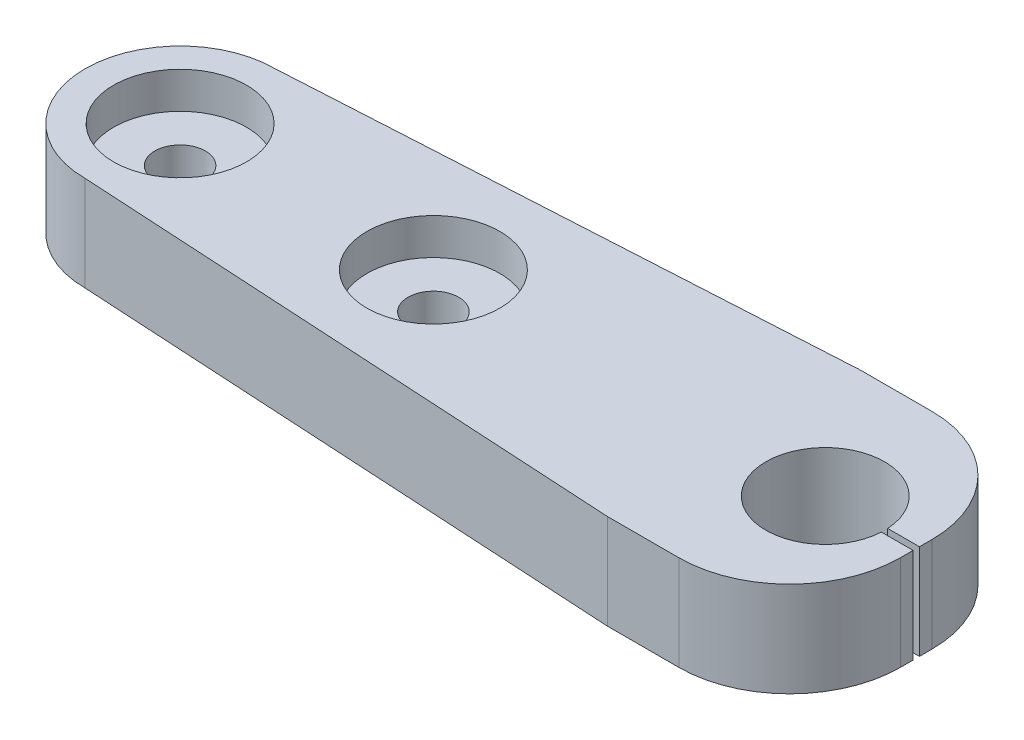
ISO-10303-21;
HEADER;
FILE_DESCRIPTION(('STEP AP214'),'2;1');
FILE_NAME('part.step','',(''),(''),'','','');
FILE_SCHEMA(('AUTOMOTIVE_DESIGN { 1 0 10303 214 1 1 1 1 }'));
ENDSEC;
DATA;
#1=APPLICATION_CONTEXT('core data for automotive mechanical design processes');
#2=APPLICATION_PROTOCOL_DEFINITION('international standard','automotive_design',2000,#1);
#3=PRODUCT_CONTEXT('',#1,'mechanical');
#4=PRODUCT('Part','Part','',(#3));
#5=PRODUCT_RELATED_PRODUCT_CATEGORY('part','',(#4));
#6=PRODUCT_DEFINITION_FORMATION('','',#4);
#7=PRODUCT_DEFINITION_CONTEXT('part definition',#1,'design');
#8=PRODUCT_DEFINITION('design','',#6,#7);
#9=PRODUCT_DEFINITION_SHAPE('','',#8);
#10=(LENGTH_UNIT() NAMED_UNIT(*) SI_UNIT(.MILLI.,.METRE.));
#11=(NAMED_UNIT(*) PLANE_ANGLE_UNIT() SI_UNIT($,.RADIAN.));
#12=(NAMED_UNIT(*) SI_UNIT($,.STERADIAN.) SOLID_ANGLE_UNIT());
#13=UNCERTAINTY_MEASURE_WITH_UNIT(LENGTH_MEASURE(1.E-05),#10,'distance_accuracy_value','');
#14=(GEOMETRIC_REPRESENTATION_CONTEXT(3) GLOBAL_UNCERTAINTY_ASSIGNED_CONTEXT((#13)) GLOBAL_UNIT_ASSIGNED_CONTEXT((#10,
#11,#12)) REPRESENTATION_CONTEXT('',''));
#15=CARTESIAN_POINT('',(0.,0.,0.));
#16=DIRECTION('',(0.,0.,1.));
#17=DIRECTION('',(1.,0.,0.));
#18=AXIS2_PLACEMENT_3D('',#15,#16,#17);
#19=CARTESIAN_POINT('',(5.75,6.,-10.));
#20=DIRECTION('',(0.,1.,0.));
#21=DIRECTION('',(0.,0.,1.));
#22=AXIS2_PLACEMENT_3D('',#19,#20,#21);
#23=PLANE('',#22);
#24=CARTESIAN_POINT('',(-19.,6.,-10.));
#25=DIRECTION('',(0.,1.,0.));
#26=DIRECTION('',(0.,0.,1.));
#27=AXIS2_PLACEMENT_3D('',#24,#25,#26);
#28=CIRCLE('',#27,4.2);
#29=CARTESIAN_POINT('',(-19.,6.,-5.80000000000001));
#30=VERTEX_POINT('',#29);
#31=EDGE_CURVE('E292',#30,#30,#28,.T.);
#32=ORIENTED_EDGE('',*,*,#31,.F.);
#33=EDGE_LOOP('',(#32));
#34=FACE_BOUND('',#33,.T.);
#35=CARTESIAN_POINT('',(-35.,6.,-10.));
#36=DIRECTION('',(0.,1.,0.));
#37=DIRECTION('',(0.,0.,1.));
#38=AXIS2_PLACEMENT_3D('',#35,#36,#37);
#39=CIRCLE('',#38,4.2);
#40=CARTESIAN_POINT('',(-35.,6.,-5.80000000000001));
#41=VERTEX_POINT('',#40);
#42=EDGE_CURVE('E302',#41,#41,#39,.T.);
#43=ORIENTED_EDGE('',*,*,#42,.F.);
#44=EDGE_LOOP('',(#43));
#45=FACE_BOUND('',#44,.T.);
#46=DIRECTION('',(-1.,0.,0.));
#47=VECTOR('',#46,1.);
#48=CARTESIAN_POINT('',(11.5,6.,-9.8));
#49=LINE('',#48,#47);
#50=CARTESIAN_POINT('',(11.5,6.,-9.8));
#51=VERTEX_POINT('',#50);
#52=CARTESIAN_POINT('',(9.49466286867056,6.,-9.8));
#53=VERTEX_POINT('',#52);
#54=EDGE_CURVE('E177',#51,#53,#49,.T.);
#55=ORIENTED_EDGE('',*,*,#54,.T.);
#56=CARTESIAN_POINT('',(5.75,6.,-10.));
#57=DIRECTION('',(0.,-1.,0.));
#58=DIRECTION('',(0.,0.,1.));
#59=AXIS2_PLACEMENT_3D('',#56,#57,#58);
#60=CIRCLE('',#59,3.75);
#61=CARTESIAN_POINT('',(9.49466286867056,6.,-10.2));
#62=VERTEX_POINT('',#61);
#63=EDGE_CURVE('E106',#53,#62,#60,.T.);
#64=ORIENTED_EDGE('',*,*,#63,.T.);
#65=DIRECTION('',(1.,0.,0.));
#66=VECTOR('',#65,1.);
#67=CARTESIAN_POINT('',(11.5,6.,-10.2));
#68=LINE('',#67,#66);
#69=CARTESIAN_POINT('',(11.5,6.,-10.2));
#70=VERTEX_POINT('',#69);
#71=EDGE_CURVE('E204',#62,#70,#68,.T.);
#72=ORIENTED_EDGE('',*,*,#71,.T.);
#73=DIRECTION('',(0.,0.,-1.));
#74=VECTOR('',#73,1.);
#75=CARTESIAN_POINT('',(11.5,6.,-10.2));
#76=LINE('',#75,#74);
#77=CARTESIAN_POINT('',(11.5,6.,-11.));
#78=VERTEX_POINT('',#77);
#79=EDGE_CURVE('E222',#70,#78,#76,.T.);
#80=ORIENTED_EDGE('',*,*,#79,.T.);
#81=CARTESIAN_POINT('',(4.5,6.,-11.));
#82=DIRECTION('',(0.,1.,0.));
#83=DIRECTION('',(0.,0.,1.));
#84=AXIS2_PLACEMENT_3D('',#81,#82,#83);
#85=CIRCLE('',#84,7.);
#86=CARTESIAN_POINT('',(4.49999999999995,6.,-18.));
#87=VERTEX_POINT('',#86);
#88=EDGE_CURVE('E219',#78,#87,#85,.T.);
#89=ORIENTED_EDGE('',*,*,#88,.T.);
#90=DIRECTION('',(-1.,0.,0.));
#91=VECTOR('',#90,1.);
#92=CARTESIAN_POINT('',(0.,6.,-18.));
#93=LINE('',#92,#91);
#94=CARTESIAN_POINT('',(0.,6.,-18.));
#95=VERTEX_POINT('',#94);
#96=EDGE_CURVE('E221',#87,#95,#93,.T.);
#97=ORIENTED_EDGE('',*,*,#96,.T.);
#98=DIRECTION('',(-0.998371334423977,0.,0.057049790538513));
#99=VECTOR('',#98,1.);
#100=CARTESIAN_POINT('',(0.,6.,-18.));
#101=LINE('',#100,#99);
#102=CARTESIAN_POINT('',(-35.,6.,-16.));
#103=VERTEX_POINT('',#102);
#104=EDGE_CURVE('E224',#95,#103,#101,.T.);
#105=ORIENTED_EDGE('',*,*,#104,.T.);
#106=CARTESIAN_POINT('',(-35.,6.,-10.));
#107=DIRECTION('',(0.,1.,0.));
#108=DIRECTION('',(0.,0.,1.));
#109=AXIS2_PLACEMENT_3D('',#106,#107,#108);
#110=CIRCLE('',#109,6.);
#111=CARTESIAN_POINT('',(-35.,6.,-4.));
#112=VERTEX_POINT('',#111);
#113=EDGE_CURVE('E230',#103,#112,#110,.T.);
#114=ORIENTED_EDGE('',*,*,#113,.T.);
#115=DIRECTION('',(0.998371334423977,0.,0.057049790538513));
#116=VECTOR('',#115,1.);
#117=CARTESIAN_POINT('',(0.,6.,-2.));
#118=LINE('',#117,#116);
#119=CARTESIAN_POINT('',(0.,6.,-2.));
#120=VERTEX_POINT('',#119);
#121=EDGE_CURVE('E136',#112,#120,#118,.T.);
#122=ORIENTED_EDGE('',*,*,#121,.T.);
#123=DIRECTION('',(1.,0.,0.));
#124=VECTOR('',#123,1.);
#125=CARTESIAN_POINT('',(0.,6.,-2.));
#126=LINE('',#125,#124);
#127=CARTESIAN_POINT('',(4.49999999999995,6.,-2.));
#128=VERTEX_POINT('',#127);
#129=EDGE_CURVE('E131',#120,#128,#126,.T.);
#130=ORIENTED_EDGE('',*,*,#129,.T.);
#131=CARTESIAN_POINT('',(4.5,6.,-9.));
#132=DIRECTION('',(0.,1.,0.));
#133=DIRECTION('',(0.,0.,1.));
#134=AXIS2_PLACEMENT_3D('',#131,#132,#133);
#135=CIRCLE('',#134,7.);
#136=CARTESIAN_POINT('',(11.5,6.,-9.00000000000005));
#137=VERTEX_POINT('',#136);
#138=EDGE_CURVE('E134',#128,#137,#135,.T.);
#139=ORIENTED_EDGE('',*,*,#138,.T.);
#140=DIRECTION('',(0.,0.,-1.));
#141=VECTOR('',#140,1.);
#142=CARTESIAN_POINT('',(11.5,6.,-9.8));
#143=LINE('',#142,#141);
#144=EDGE_CURVE('E51',#137,#51,#143,.T.);
#145=ORIENTED_EDGE('',*,*,#144,.T.);
#146=EDGE_LOOP('',(#55,#64,#72,#80,#89,#97,#105,#114,#122,#130,#139,#145));
#147=FACE_BOUND('',#146,.T.);
#148=ADVANCED_FACE('F34',(#34,#45,#147),#23,.T.);
#149=CARTESIAN_POINT('',(5.75,0.,-10.));
#150=DIRECTION('',(0.,1.,0.));
#151=DIRECTION('',(0.,0.,1.));
#152=AXIS2_PLACEMENT_3D('',#149,#150,#151);
#153=PLANE('',#152);
#154=CARTESIAN_POINT('',(-19.,0.,-10.));
#155=DIRECTION('',(0.,1.,0.));
#156=DIRECTION('',(0.,0.,1.));
#157=AXIS2_PLACEMENT_3D('',#154,#155,#156);
#158=CIRCLE('',#157,1.60000000000001);
#159=CARTESIAN_POINT('',(-19.,0.,-8.39999999999999));
#160=VERTEX_POINT('',#159);
#161=EDGE_CURVE('E299',#160,#160,#158,.T.);
#162=ORIENTED_EDGE('',*,*,#161,.T.);
#163=EDGE_LOOP('',(#162));
#164=FACE_BOUND('',#163,.T.);
#165=CARTESIAN_POINT('',(-35.,0.,-10.));
#166=DIRECTION('',(0.,1.,0.));
#167=DIRECTION('',(0.,0.,1.));
#168=AXIS2_PLACEMENT_3D('',#165,#166,#167);
#169=CIRCLE('',#168,1.60000000000001);
#170=CARTESIAN_POINT('',(-35.,0.,-8.39999999999999));
#171=VERTEX_POINT('',#170);
#172=EDGE_CURVE('E158',#171,#171,#169,.T.);
#173=ORIENTED_EDGE('',*,*,#172,.T.);
#174=EDGE_LOOP('',(#173));
#175=FACE_BOUND('',#174,.T.);
#176=DIRECTION('',(-1.,0.,0.));
#177=VECTOR('',#176,1.);
#178=CARTESIAN_POINT('',(11.5,0.,-9.8));
#179=LINE('',#178,#177);
#180=CARTESIAN_POINT('',(11.5,0.,-9.8));
#181=VERTEX_POINT('',#180);
#182=CARTESIAN_POINT('',(9.49466286867056,0.,-9.8));
#183=VERTEX_POINT('',#182);
#184=EDGE_CURVE('E154',#181,#183,#179,.T.);
#185=ORIENTED_EDGE('',*,*,#184,.F.);
#186=DIRECTION('',(0.,0.,-1.));
#187=VECTOR('',#186,1.);
#188=CARTESIAN_POINT('',(11.5,0.,-9.8));
#189=LINE('',#188,#187);
#190=CARTESIAN_POINT('',(11.5,0.,-9.00000000000005));
#191=VERTEX_POINT('',#190);
#192=EDGE_CURVE('E98',#191,#181,#189,.T.);
#193=ORIENTED_EDGE('',*,*,#192,.F.);
#194=CARTESIAN_POINT('',(4.5,0.,-9.));
#195=DIRECTION('',(0.,1.,0.));
#196=DIRECTION('',(0.,0.,1.));
#197=AXIS2_PLACEMENT_3D('',#194,#195,#196);
#198=CIRCLE('',#197,7.);
#199=CARTESIAN_POINT('',(4.49999999999995,0.,-2.));
#200=VERTEX_POINT('',#199);
#201=EDGE_CURVE('E92',#200,#191,#198,.T.);
#202=ORIENTED_EDGE('',*,*,#201,.F.);
#203=DIRECTION('',(1.,0.,0.));
#204=VECTOR('',#203,1.);
#205=CARTESIAN_POINT('',(0.,0.,-2.));
#206=LINE('',#205,#204);
#207=CARTESIAN_POINT('',(0.,0.,-2.));
#208=VERTEX_POINT('',#207);
#209=EDGE_CURVE('E144',#208,#200,#206,.T.);
#210=ORIENTED_EDGE('',*,*,#209,.F.);
#211=DIRECTION('',(0.998371334423977,0.,0.057049790538513));
#212=VECTOR('',#211,1.);
#213=CARTESIAN_POINT('',(0.,0.,-2.));
#214=LINE('',#213,#212);
#215=CARTESIAN_POINT('',(-35.,0.,-4.));
#216=VERTEX_POINT('',#215);
#217=EDGE_CURVE('E172',#216,#208,#214,.T.);
#218=ORIENTED_EDGE('',*,*,#217,.F.);
#219=CARTESIAN_POINT('',(-35.,0.,-10.));
#220=DIRECTION('',(0.,1.,0.));
#221=DIRECTION('',(0.,0.,1.));
#222=AXIS2_PLACEMENT_3D('',#219,#220,#221);
#223=CIRCLE('',#222,6.);
#224=CARTESIAN_POINT('',(-35.,0.,-16.));
#225=VERTEX_POINT('',#224);
#226=EDGE_CURVE('E170',#225,#216,#223,.T.);
#227=ORIENTED_EDGE('',*,*,#226,.F.);
#228=DIRECTION('',(-0.998371334423977,0.,0.057049790538513));
#229=VECTOR('',#228,1.);
#230=CARTESIAN_POINT('',(0.,0.,-18.));
#231=LINE('',#230,#229);
#232=CARTESIAN_POINT('',(0.,0.,-18.));
#233=VERTEX_POINT('',#232);
#234=EDGE_CURVE('E168',#233,#225,#231,.T.);
#235=ORIENTED_EDGE('',*,*,#234,.F.);
#236=DIRECTION('',(-1.,0.,0.));
#237=VECTOR('',#236,1.);
#238=CARTESIAN_POINT('',(0.,0.,-18.));
#239=LINE('',#238,#237);
#240=CARTESIAN_POINT('',(4.49999999999995,0.,-18.));
#241=VERTEX_POINT('',#240);
#242=EDGE_CURVE('E166',#241,#233,#239,.T.);
#243=ORIENTED_EDGE('',*,*,#242,.F.);
#244=CARTESIAN_POINT('',(4.5,0.,-11.));
#245=DIRECTION('',(0.,1.,0.));
#246=DIRECTION('',(0.,0.,1.));
#247=AXIS2_PLACEMENT_3D('',#244,#245,#246);
#248=CIRCLE('',#247,7.);
#249=CARTESIAN_POINT('',(11.5,0.,-11.));
#250=VERTEX_POINT('',#249);
#251=EDGE_CURVE('E164',#250,#241,#248,.T.);
#252=ORIENTED_EDGE('',*,*,#251,.F.);
#253=DIRECTION('',(0.,0.,-1.));
#254=VECTOR('',#253,1.);
#255=CARTESIAN_POINT('',(11.5,0.,-10.2));
#256=LINE('',#255,#254);
#257=CARTESIAN_POINT('',(11.5,0.,-10.2));
#258=VERTEX_POINT('',#257);
#259=EDGE_CURVE('E162',#258,#250,#256,.T.);
#260=ORIENTED_EDGE('',*,*,#259,.F.);
#261=DIRECTION('',(1.,0.,0.));
#262=VECTOR('',#261,1.);
#263=CARTESIAN_POINT('',(11.5,0.,-10.2));
#264=LINE('',#263,#262);
#265=CARTESIAN_POINT('',(9.49466286867056,0.,-10.2));
#266=VERTEX_POINT('',#265);
#267=EDGE_CURVE('E160',#266,#258,#264,.T.);
#268=ORIENTED_EDGE('',*,*,#267,.F.);
#269=CARTESIAN_POINT('',(5.75,0.,-10.));
#270=DIRECTION('',(0.,-1.,0.));
#271=DIRECTION('',(0.,0.,1.));
#272=AXIS2_PLACEMENT_3D('',#269,#270,#271);
#273=CIRCLE('',#272,3.75);
#274=EDGE_CURVE('E157',#183,#266,#273,.T.);
#275=ORIENTED_EDGE('',*,*,#274,.F.);
#276=EDGE_LOOP('',(#185,#193,#202,#210,#218,#227,#235,#243,#252,#260,#268,#275));
#277=FACE_BOUND('',#276,.T.);
#278=ADVANCED_FACE('F208',(#164,#175,#277),#153,.F.);
#279=CARTESIAN_POINT('',(11.5,6.,-9.8));
#280=DIRECTION('',(0.,0.,1.));
#281=DIRECTION('',(1.,0.,0.));
#282=AXIS2_PLACEMENT_3D('',#279,#280,#281);
#283=PLANE('',#282);
#284=ORIENTED_EDGE('',*,*,#184,.T.);
#285=DIRECTION('',(0.,-1.,0.));
#286=VECTOR('',#285,1.);
#287=CARTESIAN_POINT('',(9.49466286867056,6.,-9.8));
#288=LINE('',#287,#286);
#289=EDGE_CURVE('E11',#53,#183,#288,.T.);
#290=ORIENTED_EDGE('',*,*,#289,.F.);
#291=ORIENTED_EDGE('',*,*,#54,.F.);
#292=DIRECTION('',(0.,-1.,0.));
#293=VECTOR('',#292,1.);
#294=CARTESIAN_POINT('',(11.5,6.,-9.8));
#295=LINE('',#294,#293);
#296=EDGE_CURVE('E150',#51,#181,#295,.T.);
#297=ORIENTED_EDGE('',*,*,#296,.T.);
#298=EDGE_LOOP('',(#284,#290,#291,#297));
#299=FACE_BOUND('',#298,.T.);
#300=ADVANCED_FACE('F36',(#299),#283,.F.);
#301=CARTESIAN_POINT('',(5.75,6.,-10.));
#302=DIRECTION('',(0.,-1.,0.));
#303=DIRECTION('',(0.,0.,-1.));
#304=AXIS2_PLACEMENT_3D('',#301,#302,#303);
#305=CYLINDRICAL_SURFACE('',#304,3.75);
#306=ORIENTED_EDGE('',*,*,#274,.T.);
#307=DIRECTION('',(0.,-1.,0.));
#308=VECTOR('',#307,1.);
#309=CARTESIAN_POINT('',(9.49466286867056,6.,-10.2));
#310=LINE('',#309,#308);
#311=EDGE_CURVE('E43',#62,#266,#310,.T.);
#312=ORIENTED_EDGE('',*,*,#311,.F.);
#313=ORIENTED_EDGE('',*,*,#63,.F.);
#314=ORIENTED_EDGE('',*,*,#289,.T.);
#315=EDGE_LOOP('',(#306,#312,#313,#314));
#316=FACE_BOUND('',#315,.T.);
#317=ADVANCED_FACE('F437',(#316),#305,.F.);
#318=CARTESIAN_POINT('',(11.5,6.,-10.2));
#319=DIRECTION('',(0.,0.,-1.));
#320=DIRECTION('',(-1.,0.,0.));
#321=AXIS2_PLACEMENT_3D('',#318,#319,#320);
#322=PLANE('',#321);
#323=ORIENTED_EDGE('',*,*,#267,.T.);
#324=DIRECTION('',(0.,-1.,0.));
#325=VECTOR('',#324,1.);
#326=CARTESIAN_POINT('',(11.5,6.,-10.2));
#327=LINE('',#326,#325);
#328=EDGE_CURVE('E196',#70,#258,#327,.T.);
#329=ORIENTED_EDGE('',*,*,#328,.F.);
#330=ORIENTED_EDGE('',*,*,#71,.F.);
#331=ORIENTED_EDGE('',*,*,#311,.T.);
#332=EDGE_LOOP('',(#323,#329,#330,#331));
#333=FACE_BOUND('',#332,.T.);
#334=ADVANCED_FACE('F202',(#333),#322,.F.);
#335=CARTESIAN_POINT('',(11.5,6.,-10.2));
#336=DIRECTION('',(-1.,0.,0.));
#337=DIRECTION('',(0.,0.,1.));
#338=AXIS2_PLACEMENT_3D('',#335,#336,#337);
#339=PLANE('',#338);
#340=ORIENTED_EDGE('',*,*,#259,.T.);
#341=DIRECTION('',(0.,-1.,0.));
#342=VECTOR('',#341,1.);
#343=CARTESIAN_POINT('',(11.5,6.,-11.));
#344=LINE('',#343,#342);
#345=EDGE_CURVE('E193',#78,#250,#344,.T.);
#346=ORIENTED_EDGE('',*,*,#345,.F.);
#347=ORIENTED_EDGE('',*,*,#79,.F.);
#348=ORIENTED_EDGE('',*,*,#328,.T.);
#349=EDGE_LOOP('',(#340,#346,#347,#348));
#350=FACE_BOUND('',#349,.T.);
#351=ADVANCED_FACE('F213',(#350),#339,.F.);
#352=CARTESIAN_POINT('',(4.5,6.,-11.));
#353=DIRECTION('',(0.,-1.,0.));
#354=DIRECTION('',(0.,0.,-1.));
#355=AXIS2_PLACEMENT_3D('',#352,#353,#354);
#356=CYLINDRICAL_SURFACE('',#355,7.);
#357=ORIENTED_EDGE('',*,*,#251,.T.);
#358=DIRECTION('',(0.,-1.,0.));
#359=VECTOR('',#358,1.);
#360=CARTESIAN_POINT('',(4.49999999999995,6.,-18.));
#361=LINE('',#360,#359);
#362=EDGE_CURVE('E190',#87,#241,#361,.T.);
#363=ORIENTED_EDGE('',*,*,#362,.F.);
#364=ORIENTED_EDGE('',*,*,#88,.F.);
#365=ORIENTED_EDGE('',*,*,#345,.T.);
#366=EDGE_LOOP('',(#357,#363,#364,#365));
#367=FACE_BOUND('',#366,.T.);
#368=ADVANCED_FACE('F217',(#367),#356,.T.);
#369=CARTESIAN_POINT('',(0.,6.,-18.));
#370=DIRECTION('',(0.,0.,1.));
#371=DIRECTION('',(1.,0.,0.));
#372=AXIS2_PLACEMENT_3D('',#369,#370,#371);
#373=PLANE('',#372);
#374=ORIENTED_EDGE('',*,*,#242,.T.);
#375=DIRECTION('',(0.,-1.,0.));
#376=VECTOR('',#375,1.);
#377=CARTESIAN_POINT('',(0.,6.,-18.));
#378=LINE('',#377,#376);
#379=EDGE_CURVE('E187',#95,#233,#378,.T.);
#380=ORIENTED_EDGE('',*,*,#379,.F.);
#381=ORIENTED_EDGE('',*,*,#96,.F.);
#382=ORIENTED_EDGE('',*,*,#362,.T.);
#383=EDGE_LOOP('',(#374,#380,#381,#382));
#384=FACE_BOUND('',#383,.T.);
#385=ADVANCED_FACE('F402',(#384),#373,.F.);
#386=CARTESIAN_POINT('',(0.,6.,-18.));
#387=DIRECTION('',(0.057049790538513,0.,0.998371334423977));
#388=DIRECTION('',(0.998371334423977,0.,-0.057049790538513));
#389=AXIS2_PLACEMENT_3D('',#386,#387,#388);
#390=PLANE('',#389);
#391=ORIENTED_EDGE('',*,*,#234,.T.);
#392=DIRECTION('',(0.,-1.,0.));
#393=VECTOR('',#392,1.);
#394=CARTESIAN_POINT('',(-35.,6.,-16.));
#395=LINE('',#394,#393);
#396=EDGE_CURVE('E184',#103,#225,#395,.T.);
#397=ORIENTED_EDGE('',*,*,#396,.F.);
#398=ORIENTED_EDGE('',*,*,#104,.F.);
#399=ORIENTED_EDGE('',*,*,#379,.T.);
#400=EDGE_LOOP('',(#391,#397,#398,#399));
#401=FACE_BOUND('',#400,.T.);
#402=ADVANCED_FACE('F393',(#401),#390,.F.);
#403=CARTESIAN_POINT('',(-35.,6.,-10.));
#404=DIRECTION('',(0.,-1.,0.));
#405=DIRECTION('',(0.,0.,-1.));
#406=AXIS2_PLACEMENT_3D('',#403,#404,#405);
#407=CYLINDRICAL_SURFACE('',#406,6.);
#408=ORIENTED_EDGE('',*,*,#226,.T.);
#409=DIRECTION('',(0.,-1.,0.));
#410=VECTOR('',#409,1.);
#411=CARTESIAN_POINT('',(-35.,6.,-4.));
#412=LINE('',#411,#410);
#413=EDGE_CURVE('E181',#112,#216,#412,.T.);
#414=ORIENTED_EDGE('',*,*,#413,.F.);
#415=ORIENTED_EDGE('',*,*,#113,.F.);
#416=ORIENTED_EDGE('',*,*,#396,.T.);
#417=EDGE_LOOP('',(#408,#414,#415,#416));
#418=FACE_BOUND('',#417,.T.);
#419=ADVANCED_FACE('F236',(#418),#407,.T.);
#420=CARTESIAN_POINT('',(0.,6.,-2.));
#421=DIRECTION('',(0.057049790538513,0.,-0.998371334423977));
#422=DIRECTION('',(-0.998371334423977,0.,-0.057049790538513));
#423=AXIS2_PLACEMENT_3D('',#420,#421,#422);
#424=PLANE('',#423);
#425=ORIENTED_EDGE('',*,*,#217,.T.);
#426=DIRECTION('',(0.,-1.,0.));
#427=VECTOR('',#426,1.);
#428=CARTESIAN_POINT('',(0.,6.,-2.));
#429=LINE('',#428,#427);
#430=EDGE_CURVE('E145',#120,#208,#429,.T.);
#431=ORIENTED_EDGE('',*,*,#430,.F.);
#432=ORIENTED_EDGE('',*,*,#121,.F.);
#433=ORIENTED_EDGE('',*,*,#413,.T.);
#434=EDGE_LOOP('',(#425,#431,#432,#433));
#435=FACE_BOUND('',#434,.T.);
#436=ADVANCED_FACE('F240',(#435),#424,.F.);
#437=CARTESIAN_POINT('',(0.,6.,-2.));
#438=DIRECTION('',(0.,0.,-1.));
#439=DIRECTION('',(-1.,0.,0.));
#440=AXIS2_PLACEMENT_3D('',#437,#438,#439);
#441=PLANE('',#440);
#442=ORIENTED_EDGE('',*,*,#209,.T.);
#443=DIRECTION('',(0.,-1.,0.));
#444=VECTOR('',#443,1.);
#445=CARTESIAN_POINT('',(4.49999999999995,6.,-2.));
#446=LINE('',#445,#444);
#447=EDGE_CURVE('E141',#128,#200,#446,.T.);
#448=ORIENTED_EDGE('',*,*,#447,.F.);
#449=ORIENTED_EDGE('',*,*,#129,.F.);
#450=ORIENTED_EDGE('',*,*,#430,.T.);
#451=EDGE_LOOP('',(#442,#448,#449,#450));
#452=FACE_BOUND('',#451,.T.);
#453=ADVANCED_FACE('F142',(#452),#441,.F.);
#454=CARTESIAN_POINT('',(4.5,6.,-9.));
#455=DIRECTION('',(0.,-1.,0.));
#456=DIRECTION('',(0.,0.,-1.));
#457=AXIS2_PLACEMENT_3D('',#454,#455,#456);
#458=CYLINDRICAL_SURFACE('',#457,7.);
#459=ORIENTED_EDGE('',*,*,#201,.T.);
#460=DIRECTION('',(0.,-1.,0.));
#461=VECTOR('',#460,1.);
#462=CARTESIAN_POINT('',(11.5,6.,-9.00000000000005));
#463=LINE('',#462,#461);
#464=EDGE_CURVE('E146',#137,#191,#463,.T.);
#465=ORIENTED_EDGE('',*,*,#464,.F.);
#466=ORIENTED_EDGE('',*,*,#138,.F.);
#467=ORIENTED_EDGE('',*,*,#447,.T.);
#468=EDGE_LOOP('',(#459,#465,#466,#467));
#469=FACE_BOUND('',#468,.T.);
#470=ADVANCED_FACE('F148',(#469),#458,.T.);
#471=CARTESIAN_POINT('',(11.5,6.,-9.8));
#472=DIRECTION('',(-1.,0.,0.));
#473=DIRECTION('',(0.,0.,1.));
#474=AXIS2_PLACEMENT_3D('',#471,#472,#473);
#475=PLANE('',#474);
#476=ORIENTED_EDGE('',*,*,#192,.T.);
#477=ORIENTED_EDGE('',*,*,#296,.F.);
#478=ORIENTED_EDGE('',*,*,#144,.F.);
#479=ORIENTED_EDGE('',*,*,#464,.T.);
#480=EDGE_LOOP('',(#476,#477,#478,#479));
#481=FACE_BOUND('',#480,.T.);
#482=ADVANCED_FACE('F244',(#481),#475,.F.);
#483=CARTESIAN_POINT('',(-35.,6.,-10.));
#484=DIRECTION('',(0.,1.,0.));
#485=DIRECTION('',(0.,0.,1.));
#486=AXIS2_PLACEMENT_3D('',#483,#484,#485);
#487=CYLINDRICAL_SURFACE('',#486,1.60000000000001);
#488=ORIENTED_EDGE('',*,*,#172,.F.);
#489=EDGE_LOOP('',(#488));
#490=FACE_BOUND('',#489,.T.);
#491=CARTESIAN_POINT('',(-35.,3.7,-10.));
#492=DIRECTION('',(0.,1.,0.));
#493=DIRECTION('',(0.,0.,1.));
#494=AXIS2_PLACEMENT_3D('',#491,#492,#493);
#495=CIRCLE('',#494,1.60000000000001);
#496=CARTESIAN_POINT('',(-35.,3.7,-8.39999999999999));
#497=VERTEX_POINT('',#496);
#498=EDGE_CURVE('E308',#497,#497,#495,.T.);
#499=ORIENTED_EDGE('',*,*,#498,.T.);
#500=EDGE_LOOP('',(#499));
#501=FACE_BOUND('',#500,.T.);
#502=ADVANCED_FACE('F246',(#490,#501),#487,.F.);
#503=CARTESIAN_POINT('',(-33.4,3.7,-10.));
#504=DIRECTION('',(0.,-1.,0.));
#505=DIRECTION('',(0.,0.,-1.));
#506=AXIS2_PLACEMENT_3D('',#503,#504,#505);
#507=PLANE('',#506);
#508=ORIENTED_EDGE('',*,*,#498,.F.);
#509=EDGE_LOOP('',(#508));
#510=FACE_BOUND('',#509,.T.);
#511=CARTESIAN_POINT('',(-35.,3.7,-10.));
#512=DIRECTION('',(0.,1.,0.));
#513=DIRECTION('',(0.,0.,1.));
#514=AXIS2_PLACEMENT_3D('',#511,#512,#513);
#515=CIRCLE('',#514,4.2);
#516=CARTESIAN_POINT('',(-35.,3.7,-5.80000000000001));
#517=VERTEX_POINT('',#516);
#518=EDGE_CURVE('E305',#517,#517,#515,.T.);
#519=ORIENTED_EDGE('',*,*,#518,.T.);
#520=EDGE_LOOP('',(#519));
#521=FACE_BOUND('',#520,.T.);
#522=ADVANCED_FACE('F252',(#510,#521),#507,.F.);
#523=CARTESIAN_POINT('',(-35.,6.,-10.));
#524=DIRECTION('',(0.,1.,0.));
#525=DIRECTION('',(0.,0.,1.));
#526=AXIS2_PLACEMENT_3D('',#523,#524,#525);
#527=CYLINDRICAL_SURFACE('',#526,4.2);
#528=ORIENTED_EDGE('',*,*,#518,.F.);
#529=EDGE_LOOP('',(#528));
#530=FACE_BOUND('',#529,.T.);
#531=ORIENTED_EDGE('',*,*,#42,.T.);
#532=EDGE_LOOP('',(#531));
#533=FACE_BOUND('',#532,.T.);
#534=ADVANCED_FACE('F269',(#530,#533),#527,.F.);
#535=CARTESIAN_POINT('',(-19.,6.,-10.));
#536=DIRECTION('',(0.,1.,0.));
#537=DIRECTION('',(0.,0.,1.));
#538=AXIS2_PLACEMENT_3D('',#535,#536,#537);
#539=CYLINDRICAL_SURFACE('',#538,1.60000000000001);
#540=ORIENTED_EDGE('',*,*,#161,.F.);
#541=EDGE_LOOP('',(#540));
#542=FACE_BOUND('',#541,.T.);
#543=CARTESIAN_POINT('',(-19.,3.7,-10.));
#544=DIRECTION('',(0.,1.,0.));
#545=DIRECTION('',(0.,0.,1.));
#546=AXIS2_PLACEMENT_3D('',#543,#544,#545);
#547=CIRCLE('',#546,1.60000000000001);
#548=CARTESIAN_POINT('',(-19.,3.7,-8.39999999999999));
#549=VERTEX_POINT('',#548);
#550=EDGE_CURVE('E294',#549,#549,#547,.T.);
#551=ORIENTED_EDGE('',*,*,#550,.T.);
#552=EDGE_LOOP('',(#551));
#553=FACE_BOUND('',#552,.T.);
#554=ADVANCED_FACE('F273',(#542,#553),#539,.F.);
#555=CARTESIAN_POINT('',(-17.4,3.7,-10.));
#556=DIRECTION('',(0.,-1.,0.));
#557=DIRECTION('',(0.,0.,-1.));
#558=AXIS2_PLACEMENT_3D('',#555,#556,#557);
#559=PLANE('',#558);
#560=ORIENTED_EDGE('',*,*,#550,.F.);
#561=EDGE_LOOP('',(#560));
#562=FACE_BOUND('',#561,.T.);
#563=CARTESIAN_POINT('',(-19.,3.7,-10.));
#564=DIRECTION('',(0.,1.,0.));
#565=DIRECTION('',(0.,0.,1.));
#566=AXIS2_PLACEMENT_3D('',#563,#564,#565);
#567=CIRCLE('',#566,4.2);
#568=CARTESIAN_POINT('',(-19.,3.7,-5.8));
#569=VERTEX_POINT('',#568);
#570=EDGE_CURVE('E290',#569,#569,#567,.T.);
#571=ORIENTED_EDGE('',*,*,#570,.T.);
#572=EDGE_LOOP('',(#571));
#573=FACE_BOUND('',#572,.T.);
#574=ADVANCED_FACE('F277',(#562,#573),#559,.F.);
#575=CARTESIAN_POINT('',(-19.,6.,-10.));
#576=DIRECTION('',(0.,1.,0.));
#577=DIRECTION('',(0.,0.,1.));
#578=AXIS2_PLACEMENT_3D('',#575,#576,#577);
#579=CYLINDRICAL_SURFACE('',#578,4.2);
#580=ORIENTED_EDGE('',*,*,#570,.F.);
#581=EDGE_LOOP('',(#580));
#582=FACE_BOUND('',#581,.T.);
#583=ORIENTED_EDGE('',*,*,#31,.T.);
#584=EDGE_LOOP('',(#583));
#585=FACE_BOUND('',#584,.T.);
#586=ADVANCED_FACE('F281',(#582,#585),#579,.F.);
#587=CLOSED_SHELL('',(#148,#278,#300,#317,#334,#351,#368,#385,#402,#419,#436,#453,#470,#482,
#502,#522,#534,#554,#574,#586));
#588=MANIFOLD_SOLID_BREP('B2',#587);
#589=ADVANCED_BREP_SHAPE_REPRESENTATION('',(#18,#588),#14);
#590=SHAPE_DEFINITION_REPRESENTATION(#9,#589);
ENDSEC;
END-ISO-10303-21;
